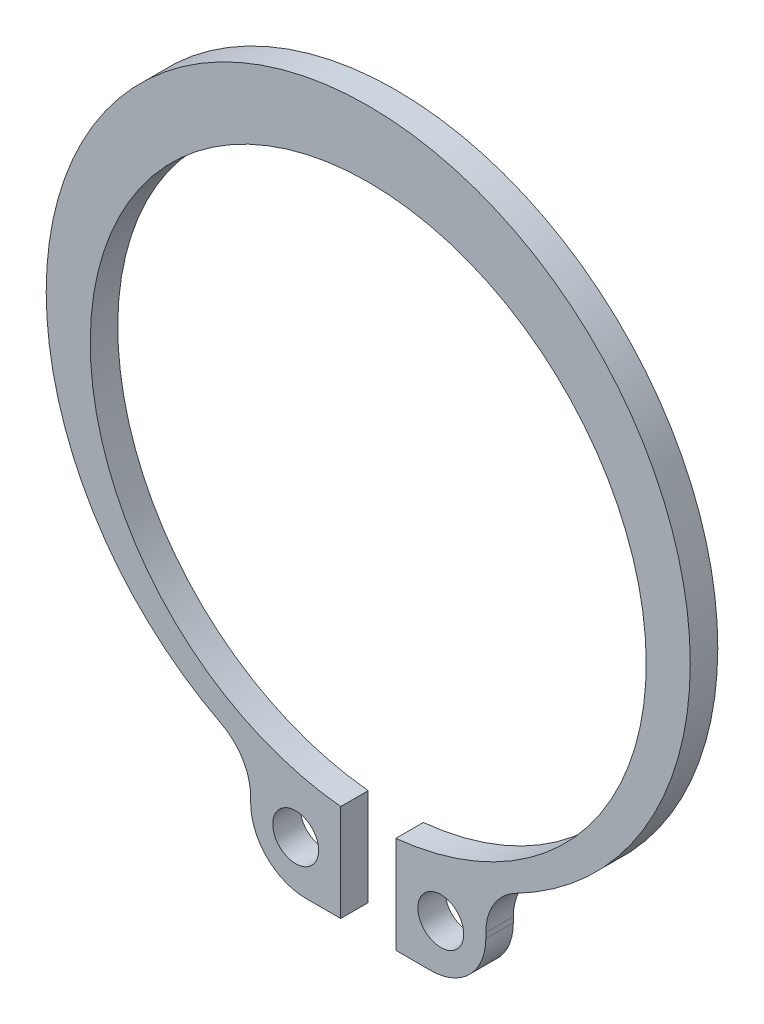
ISO-10303-21;
HEADER;
FILE_DESCRIPTION(('STEP AP214'),'2;1');
FILE_NAME('part.step','',(''),(''),'','','');
FILE_SCHEMA(('AUTOMOTIVE_DESIGN { 1 0 10303 214 1 1 1 1 }'));
ENDSEC;
DATA;
#1=APPLICATION_CONTEXT('core data for automotive mechanical design processes');
#2=APPLICATION_PROTOCOL_DEFINITION('international standard','automotive_design',2000,#1);
#3=PRODUCT_CONTEXT('',#1,'mechanical');
#4=PRODUCT('Part','Part','',(#3));
#5=PRODUCT_RELATED_PRODUCT_CATEGORY('part','',(#4));
#6=PRODUCT_DEFINITION_FORMATION('','',#4);
#7=PRODUCT_DEFINITION_CONTEXT('part definition',#1,'design');
#8=PRODUCT_DEFINITION('design','',#6,#7);
#9=PRODUCT_DEFINITION_SHAPE('','',#8);
#10=(LENGTH_UNIT() NAMED_UNIT(*) SI_UNIT(.MILLI.,.METRE.));
#11=(NAMED_UNIT(*) PLANE_ANGLE_UNIT() SI_UNIT($,.RADIAN.));
#12=(NAMED_UNIT(*) SI_UNIT($,.STERADIAN.) SOLID_ANGLE_UNIT());
#13=UNCERTAINTY_MEASURE_WITH_UNIT(LENGTH_MEASURE(1.E-05),#10,'distance_accuracy_value','');
#14=(GEOMETRIC_REPRESENTATION_CONTEXT(3) GLOBAL_UNCERTAINTY_ASSIGNED_CONTEXT((#13)) GLOBAL_UNIT_ASSIGNED_CONTEXT((#10,
#11,#12)) REPRESENTATION_CONTEXT('',''));
#15=CARTESIAN_POINT('',(0.,0.,0.));
#16=DIRECTION('',(0.,0.,1.));
#17=DIRECTION('',(1.,0.,0.));
#18=AXIS2_PLACEMENT_3D('',#15,#16,#17);
#19=CARTESIAN_POINT('',(-9.40667556246859,-17.0706583040255,1.5));
#20=DIRECTION('',(0.,0.,-1.));
#21=DIRECTION('',(-1.,0.,0.));
#22=AXIS2_PLACEMENT_3D('',#19,#20,#21);
#23=CYLINDRICAL_SURFACE('',#22,3.);
#24=CARTESIAN_POINT('',(-9.40667556246859,-17.0706583040255,0.));
#25=DIRECTION('',(0.,0.,1.));
#26=DIRECTION('',(1.,0.,0.));
#27=AXIS2_PLACEMENT_3D('',#24,#25,#26);
#28=CIRCLE('',#27,3.);
#29=CARTESIAN_POINT('',(-6.40667556246859,-17.0706583040255,0.));
#30=VERTEX_POINT('',#29);
#31=CARTESIAN_POINT('',(-8.03343825407902,-14.4034089165765,0.));
#32=VERTEX_POINT('',#31);
#33=EDGE_CURVE('E126',#30,#32,#28,.T.);
#34=ORIENTED_EDGE('',*,*,#33,.F.);
#35=DIRECTION('',(0.,0.,-1.));
#36=VECTOR('',#35,1.);
#37=CARTESIAN_POINT('',(-6.40667556246859,-17.0706583040255,1.5));
#38=LINE('',#37,#36);
#39=CARTESIAN_POINT('',(-6.40667556246859,-17.0706583040255,1.5));
#40=VERTEX_POINT('',#39);
#41=EDGE_CURVE('E31',#40,#30,#38,.T.);
#42=ORIENTED_EDGE('',*,*,#41,.F.);
#43=CARTESIAN_POINT('',(-9.40667556246859,-17.0706583040255,1.5));
#44=DIRECTION('',(0.,0.,1.));
#45=DIRECTION('',(1.,0.,0.));
#46=AXIS2_PLACEMENT_3D('',#43,#44,#45);
#47=CIRCLE('',#46,3.);
#48=CARTESIAN_POINT('',(-8.03343825407902,-14.4034089165765,1.5));
#49=VERTEX_POINT('',#48);
#50=EDGE_CURVE('E156',#40,#49,#47,.T.);
#51=ORIENTED_EDGE('',*,*,#50,.T.);
#52=DIRECTION('',(0.,0.,-1.));
#53=VECTOR('',#52,1.);
#54=CARTESIAN_POINT('',(-8.03343825407902,-14.4034089165765,1.5));
#55=LINE('',#54,#53);
#56=EDGE_CURVE('E11',#49,#32,#55,.T.);
#57=ORIENTED_EDGE('',*,*,#56,.T.);
#58=EDGE_LOOP('',(#34,#42,#51,#57));
#59=FACE_BOUND('',#58,.T.);
#60=ADVANCED_FACE('F17',(#59),#23,.F.);
#61=CARTESIAN_POINT('',(0.,1.2,1.5));
#62=DIRECTION('',(0.,0.,-1.));
#63=DIRECTION('',(-1.,0.,0.));
#64=AXIS2_PLACEMENT_3D('',#61,#62,#63);
#65=CYLINDRICAL_SURFACE('',#64,17.55);
#66=CARTESIAN_POINT('',(0.,1.2,0.));
#67=DIRECTION('',(0.,0.,1.));
#68=DIRECTION('',(1.,0.,0.));
#69=AXIS2_PLACEMENT_3D('',#66,#67,#68);
#70=CIRCLE('',#69,17.55);
#71=CARTESIAN_POINT('',(8.033438254079,-14.4034089165765,0.));
#72=VERTEX_POINT('',#71);
#73=EDGE_CURVE('E108',#72,#32,#70,.T.);
#74=ORIENTED_EDGE('',*,*,#73,.T.);
#75=ORIENTED_EDGE('',*,*,#56,.F.);
#76=CARTESIAN_POINT('',(0.,1.2,1.5));
#77=DIRECTION('',(0.,0.,1.));
#78=DIRECTION('',(1.,0.,0.));
#79=AXIS2_PLACEMENT_3D('',#76,#77,#78);
#80=CIRCLE('',#79,17.55);
#81=CARTESIAN_POINT('',(8.033438254079,-14.4034089165765,1.5));
#82=VERTEX_POINT('',#81);
#83=EDGE_CURVE('E111',#82,#49,#80,.T.);
#84=ORIENTED_EDGE('',*,*,#83,.F.);
#85=DIRECTION('',(0.,0.,-1.));
#86=VECTOR('',#85,1.);
#87=CARTESIAN_POINT('',(8.033438254079,-14.4034089165765,1.5));
#88=LINE('',#87,#86);
#89=EDGE_CURVE('E20',#82,#72,#88,.T.);
#90=ORIENTED_EDGE('',*,*,#89,.T.);
#91=EDGE_LOOP('',(#74,#75,#84,#90));
#92=FACE_BOUND('',#91,.T.);
#93=ADVANCED_FACE('F106',(#92),#65,.T.);
#94=CARTESIAN_POINT('',(9.40667556246858,-17.0706583040255,1.5));
#95=DIRECTION('',(0.,0.,-1.));
#96=DIRECTION('',(-1.,0.,0.));
#97=AXIS2_PLACEMENT_3D('',#94,#95,#96);
#98=CYLINDRICAL_SURFACE('',#97,3.);
#99=CARTESIAN_POINT('',(9.40667556246858,-17.0706583040255,0.));
#100=DIRECTION('',(0.,0.,1.));
#101=DIRECTION('',(1.,0.,0.));
#102=AXIS2_PLACEMENT_3D('',#99,#100,#101);
#103=CIRCLE('',#102,3.);
#104=CARTESIAN_POINT('',(6.40667556246858,-17.0706583040255,0.));
#105=VERTEX_POINT('',#104);
#106=EDGE_CURVE('E117',#72,#105,#103,.T.);
#107=ORIENTED_EDGE('',*,*,#106,.F.);
#108=ORIENTED_EDGE('',*,*,#89,.F.);
#109=CARTESIAN_POINT('',(9.40667556246858,-17.0706583040255,1.5));
#110=DIRECTION('',(0.,0.,1.));
#111=DIRECTION('',(1.,0.,0.));
#112=AXIS2_PLACEMENT_3D('',#109,#110,#111);
#113=CIRCLE('',#112,3.);
#114=CARTESIAN_POINT('',(6.40667556246858,-17.0706583040255,1.5));
#115=VERTEX_POINT('',#114);
#116=EDGE_CURVE('E159',#82,#115,#113,.T.);
#117=ORIENTED_EDGE('',*,*,#116,.T.);
#118=DIRECTION('',(0.,0.,-1.));
#119=VECTOR('',#118,1.);
#120=CARTESIAN_POINT('',(6.40667556246858,-17.0706583040255,1.5));
#121=LINE('',#120,#119);
#122=EDGE_CURVE('E115',#115,#105,#121,.T.);
#123=ORIENTED_EDGE('',*,*,#122,.T.);
#124=EDGE_LOOP('',(#107,#108,#117,#123));
#125=FACE_BOUND('',#124,.T.);
#126=ADVANCED_FACE('F118',(#125),#98,.F.);
#127=CARTESIAN_POINT('',(6.40667556246858,-17.36,1.5));
#128=DIRECTION('',(-1.,0.,0.));
#129=DIRECTION('',(0.,-1.,0.));
#130=AXIS2_PLACEMENT_3D('',#127,#128,#129);
#131=PLANE('',#130);
#132=DIRECTION('',(0.,1.,0.));
#133=VECTOR('',#132,1.);
#134=CARTESIAN_POINT('',(6.40667556246858,-17.36,0.));
#135=LINE('',#134,#133);
#136=CARTESIAN_POINT('',(6.40667556246858,-17.36,0.));
#137=VERTEX_POINT('',#136);
#138=EDGE_CURVE('E122',#137,#105,#135,.T.);
#139=ORIENTED_EDGE('',*,*,#138,.T.);
#140=ORIENTED_EDGE('',*,*,#122,.F.);
#141=DIRECTION('',(0.,1.,0.));
#142=VECTOR('',#141,1.);
#143=CARTESIAN_POINT('',(6.40667556246858,-17.36,1.5));
#144=LINE('',#143,#142);
#145=CARTESIAN_POINT('',(6.40667556246858,-17.36,1.5));
#146=VERTEX_POINT('',#145);
#147=EDGE_CURVE('E161',#146,#115,#144,.T.);
#148=ORIENTED_EDGE('',*,*,#147,.F.);
#149=DIRECTION('',(0.,0.,-1.));
#150=VECTOR('',#149,1.);
#151=CARTESIAN_POINT('',(6.40667556246858,-17.36,1.5));
#152=LINE('',#151,#150);
#153=EDGE_CURVE('E203',#146,#137,#152,.T.);
#154=ORIENTED_EDGE('',*,*,#153,.T.);
#155=EDGE_LOOP('',(#139,#140,#148,#154));
#156=FACE_BOUND('',#155,.T.);
#157=ADVANCED_FACE('F207',(#156),#131,.F.);
#158=CARTESIAN_POINT('',(3.40667556246858,-17.36,1.5));
#159=DIRECTION('',(0.,0.,-1.));
#160=DIRECTION('',(-1.,0.,0.));
#161=AXIS2_PLACEMENT_3D('',#158,#159,#160);
#162=CYLINDRICAL_SURFACE('',#161,3.);
#163=CARTESIAN_POINT('',(3.40667556246858,-17.36,0.));
#164=DIRECTION('',(0.,0.,1.));
#165=DIRECTION('',(1.,0.,0.));
#166=AXIS2_PLACEMENT_3D('',#163,#164,#165);
#167=CIRCLE('',#166,3.);
#168=CARTESIAN_POINT('',(3.40667556246858,-20.36,0.));
#169=VERTEX_POINT('',#168);
#170=EDGE_CURVE('E134',#169,#137,#167,.T.);
#171=ORIENTED_EDGE('',*,*,#170,.T.);
#172=ORIENTED_EDGE('',*,*,#153,.F.);
#173=CARTESIAN_POINT('',(3.40667556246858,-17.36,1.5));
#174=DIRECTION('',(0.,0.,1.));
#175=DIRECTION('',(1.,0.,0.));
#176=AXIS2_PLACEMENT_3D('',#173,#174,#175);
#177=CIRCLE('',#176,3.);
#178=CARTESIAN_POINT('',(3.40667556246858,-20.36,1.5));
#179=VERTEX_POINT('',#178);
#180=EDGE_CURVE('E164',#179,#146,#177,.T.);
#181=ORIENTED_EDGE('',*,*,#180,.F.);
#182=DIRECTION('',(0.,0.,-1.));
#183=VECTOR('',#182,1.);
#184=CARTESIAN_POINT('',(3.40667556246858,-20.36,1.5));
#185=LINE('',#184,#183);
#186=EDGE_CURVE('E201',#179,#169,#185,.T.);
#187=ORIENTED_EDGE('',*,*,#186,.T.);
#188=EDGE_LOOP('',(#171,#172,#181,#187));
#189=FACE_BOUND('',#188,.T.);
#190=ADVANCED_FACE('F211',(#189),#162,.T.);
#191=CARTESIAN_POINT('',(1.5,-20.36,1.5));
#192=DIRECTION('',(0.,1.,0.));
#193=DIRECTION('',(0.,0.,1.));
#194=AXIS2_PLACEMENT_3D('',#191,#192,#193);
#195=PLANE('',#194);
#196=DIRECTION('',(1.,0.,0.));
#197=VECTOR('',#196,1.);
#198=CARTESIAN_POINT('',(1.5,-20.36,0.));
#199=LINE('',#198,#197);
#200=CARTESIAN_POINT('',(1.5,-20.36,0.));
#201=VERTEX_POINT('',#200);
#202=EDGE_CURVE('E137',#201,#169,#199,.T.);
#203=ORIENTED_EDGE('',*,*,#202,.T.);
#204=ORIENTED_EDGE('',*,*,#186,.F.);
#205=DIRECTION('',(1.,0.,0.));
#206=VECTOR('',#205,1.);
#207=CARTESIAN_POINT('',(1.5,-20.36,1.5));
#208=LINE('',#207,#206);
#209=CARTESIAN_POINT('',(1.5,-20.36,1.5));
#210=VERTEX_POINT('',#209);
#211=EDGE_CURVE('E167',#210,#179,#208,.T.);
#212=ORIENTED_EDGE('',*,*,#211,.F.);
#213=DIRECTION('',(0.,0.,-1.));
#214=VECTOR('',#213,1.);
#215=CARTESIAN_POINT('',(1.5,-20.36,1.5));
#216=LINE('',#215,#214);
#217=EDGE_CURVE('E199',#210,#201,#216,.T.);
#218=ORIENTED_EDGE('',*,*,#217,.T.);
#219=EDGE_LOOP('',(#203,#204,#212,#218));
#220=FACE_BOUND('',#219,.T.);
#221=ADVANCED_FACE('F215',(#220),#195,.F.);
#222=CARTESIAN_POINT('',(1.5,-20.36,1.5));
#223=DIRECTION('',(-1.,0.,0.));
#224=DIRECTION('',(0.,-1.,0.));
#225=AXIS2_PLACEMENT_3D('',#222,#223,#224);
#226=PLANE('',#225);
#227=DIRECTION('',(0.,1.,0.));
#228=VECTOR('',#227,1.);
#229=CARTESIAN_POINT('',(1.5,-20.36,0.));
#230=LINE('',#229,#228);
#231=CARTESIAN_POINT('',(1.5,-15.0755596911027,0.));
#232=VERTEX_POINT('',#231);
#233=EDGE_CURVE('E140',#201,#232,#230,.T.);
#234=ORIENTED_EDGE('',*,*,#233,.F.);
#235=ORIENTED_EDGE('',*,*,#217,.F.);
#236=DIRECTION('',(0.,1.,0.));
#237=VECTOR('',#236,1.);
#238=CARTESIAN_POINT('',(1.5,-20.36,1.5));
#239=LINE('',#238,#237);
#240=CARTESIAN_POINT('',(1.5,-15.0755596911027,1.5));
#241=VERTEX_POINT('',#240);
#242=EDGE_CURVE('E170',#210,#241,#239,.T.);
#243=ORIENTED_EDGE('',*,*,#242,.T.);
#244=DIRECTION('',(0.,0.,-1.));
#245=VECTOR('',#244,1.);
#246=CARTESIAN_POINT('',(1.5,-15.0755596911027,1.5));
#247=LINE('',#246,#245);
#248=EDGE_CURVE('E197',#241,#232,#247,.T.);
#249=ORIENTED_EDGE('',*,*,#248,.T.);
#250=EDGE_LOOP('',(#234,#235,#243,#249));
#251=FACE_BOUND('',#250,.T.);
#252=ADVANCED_FACE('F219',(#251),#226,.T.);
#253=CARTESIAN_POINT('',(0.,0.,1.5));
#254=DIRECTION('',(0.,0.,-1.));
#255=DIRECTION('',(-1.,0.,0.));
#256=AXIS2_PLACEMENT_3D('',#253,#254,#255);
#257=CYLINDRICAL_SURFACE('',#256,15.15);
#258=CARTESIAN_POINT('',(0.,0.,0.));
#259=DIRECTION('',(0.,0.,1.));
#260=DIRECTION('',(1.,0.,0.));
#261=AXIS2_PLACEMENT_3D('',#258,#259,#260);
#262=CIRCLE('',#261,15.15);
#263=CARTESIAN_POINT('',(-1.5,-15.0755596911027,0.));
#264=VERTEX_POINT('',#263);
#265=EDGE_CURVE('E143',#232,#264,#262,.T.);
#266=ORIENTED_EDGE('',*,*,#265,.F.);
#267=ORIENTED_EDGE('',*,*,#248,.F.);
#268=CARTESIAN_POINT('',(0.,0.,1.5));
#269=DIRECTION('',(0.,0.,1.));
#270=DIRECTION('',(1.,0.,0.));
#271=AXIS2_PLACEMENT_3D('',#268,#269,#270);
#272=CIRCLE('',#271,15.15);
#273=CARTESIAN_POINT('',(-1.5,-15.0755596911027,1.5));
#274=VERTEX_POINT('',#273);
#275=EDGE_CURVE('E173',#241,#274,#272,.T.);
#276=ORIENTED_EDGE('',*,*,#275,.T.);
#277=DIRECTION('',(0.,0.,-1.));
#278=VECTOR('',#277,1.);
#279=CARTESIAN_POINT('',(-1.5,-15.0755596911027,1.5));
#280=LINE('',#279,#278);
#281=EDGE_CURVE('E195',#274,#264,#280,.T.);
#282=ORIENTED_EDGE('',*,*,#281,.T.);
#283=EDGE_LOOP('',(#266,#267,#276,#282));
#284=FACE_BOUND('',#283,.T.);
#285=ADVANCED_FACE('F223',(#284),#257,.F.);
#286=CARTESIAN_POINT('',(-1.5,-20.36,1.5));
#287=DIRECTION('',(-1.,0.,0.));
#288=DIRECTION('',(0.,-1.,0.));
#289=AXIS2_PLACEMENT_3D('',#286,#287,#288);
#290=PLANE('',#289);
#291=DIRECTION('',(0.,1.,0.));
#292=VECTOR('',#291,1.);
#293=CARTESIAN_POINT('',(-1.5,-20.36,0.));
#294=LINE('',#293,#292);
#295=CARTESIAN_POINT('',(-1.5,-20.36,0.));
#296=VERTEX_POINT('',#295);
#297=EDGE_CURVE('E146',#296,#264,#294,.T.);
#298=ORIENTED_EDGE('',*,*,#297,.T.);
#299=ORIENTED_EDGE('',*,*,#281,.F.);
#300=DIRECTION('',(0.,1.,0.));
#301=VECTOR('',#300,1.);
#302=CARTESIAN_POINT('',(-1.5,-20.36,1.5));
#303=LINE('',#302,#301);
#304=CARTESIAN_POINT('',(-1.5,-20.36,1.5));
#305=VERTEX_POINT('',#304);
#306=EDGE_CURVE('E176',#305,#274,#303,.T.);
#307=ORIENTED_EDGE('',*,*,#306,.F.);
#308=DIRECTION('',(0.,0.,-1.));
#309=VECTOR('',#308,1.);
#310=CARTESIAN_POINT('',(-1.5,-20.36,1.5));
#311=LINE('',#310,#309);
#312=EDGE_CURVE('E193',#305,#296,#311,.T.);
#313=ORIENTED_EDGE('',*,*,#312,.T.);
#314=EDGE_LOOP('',(#298,#299,#307,#313));
#315=FACE_BOUND('',#314,.T.);
#316=ADVANCED_FACE('F228',(#315),#290,.F.);
#317=CARTESIAN_POINT('',(-3.40667556246859,-20.36,1.5));
#318=DIRECTION('',(0.,1.,0.));
#319=DIRECTION('',(0.,0.,1.));
#320=AXIS2_PLACEMENT_3D('',#317,#318,#319);
#321=PLANE('',#320);
#322=DIRECTION('',(1.,0.,0.));
#323=VECTOR('',#322,1.);
#324=CARTESIAN_POINT('',(-3.40667556246859,-20.36,0.));
#325=LINE('',#324,#323);
#326=CARTESIAN_POINT('',(-3.40667556246859,-20.36,0.));
#327=VERTEX_POINT('',#326);
#328=EDGE_CURVE('E149',#327,#296,#325,.T.);
#329=ORIENTED_EDGE('',*,*,#328,.T.);
#330=ORIENTED_EDGE('',*,*,#312,.F.);
#331=DIRECTION('',(1.,0.,0.));
#332=VECTOR('',#331,1.);
#333=CARTESIAN_POINT('',(-3.40667556246859,-20.36,1.5));
#334=LINE('',#333,#332);
#335=CARTESIAN_POINT('',(-3.40667556246859,-20.36,1.5));
#336=VERTEX_POINT('',#335);
#337=EDGE_CURVE('E179',#336,#305,#334,.T.);
#338=ORIENTED_EDGE('',*,*,#337,.F.);
#339=DIRECTION('',(0.,0.,-1.));
#340=VECTOR('',#339,1.);
#341=CARTESIAN_POINT('',(-3.40667556246859,-20.36,1.5));
#342=LINE('',#341,#340);
#343=EDGE_CURVE('E191',#336,#327,#342,.T.);
#344=ORIENTED_EDGE('',*,*,#343,.T.);
#345=EDGE_LOOP('',(#329,#330,#338,#344));
#346=FACE_BOUND('',#345,.T.);
#347=ADVANCED_FACE('F232',(#346),#321,.F.);
#348=CARTESIAN_POINT('',(-3.40667556246858,-17.36,1.5));
#349=DIRECTION('',(0.,0.,-1.));
#350=DIRECTION('',(-1.,0.,0.));
#351=AXIS2_PLACEMENT_3D('',#348,#349,#350);
#352=CYLINDRICAL_SURFACE('',#351,3.);
#353=CARTESIAN_POINT('',(-3.40667556246858,-17.36,0.));
#354=DIRECTION('',(0.,0.,1.));
#355=DIRECTION('',(1.,0.,0.));
#356=AXIS2_PLACEMENT_3D('',#353,#354,#355);
#357=CIRCLE('',#356,3.);
#358=CARTESIAN_POINT('',(-6.40667556246859,-17.36,0.));
#359=VERTEX_POINT('',#358);
#360=EDGE_CURVE('E152',#359,#327,#357,.T.);
#361=ORIENTED_EDGE('',*,*,#360,.T.);
#362=ORIENTED_EDGE('',*,*,#343,.F.);
#363=CARTESIAN_POINT('',(-3.40667556246858,-17.36,1.5));
#364=DIRECTION('',(0.,0.,1.));
#365=DIRECTION('',(1.,0.,0.));
#366=AXIS2_PLACEMENT_3D('',#363,#364,#365);
#367=CIRCLE('',#366,3.);
#368=CARTESIAN_POINT('',(-6.40667556246859,-17.36,1.5));
#369=VERTEX_POINT('',#368);
#370=EDGE_CURVE('E182',#369,#336,#367,.T.);
#371=ORIENTED_EDGE('',*,*,#370,.F.);
#372=DIRECTION('',(0.,0.,-1.));
#373=VECTOR('',#372,1.);
#374=CARTESIAN_POINT('',(-6.40667556246859,-17.36,1.5));
#375=LINE('',#374,#373);
#376=EDGE_CURVE('E38',#369,#359,#375,.T.);
#377=ORIENTED_EDGE('',*,*,#376,.T.);
#378=EDGE_LOOP('',(#361,#362,#371,#377));
#379=FACE_BOUND('',#378,.T.);
#380=ADVANCED_FACE('F234',(#379),#352,.T.);
#381=CARTESIAN_POINT('',(-6.40667556246859,-17.0706583040255,1.5));
#382=DIRECTION('',(1.,0.,0.));
#383=DIRECTION('',(0.,0.,-1.));
#384=AXIS2_PLACEMENT_3D('',#381,#382,#383);
#385=PLANE('',#384);
#386=DIRECTION('',(0.,-1.,0.));
#387=VECTOR('',#386,1.);
#388=CARTESIAN_POINT('',(-6.40667556246859,-17.0706583040255,0.));
#389=LINE('',#388,#387);
#390=EDGE_CURVE('E155',#30,#359,#389,.T.);
#391=ORIENTED_EDGE('',*,*,#390,.T.);
#392=ORIENTED_EDGE('',*,*,#376,.F.);
#393=DIRECTION('',(0.,-1.,0.));
#394=VECTOR('',#393,1.);
#395=CARTESIAN_POINT('',(-6.40667556246859,-17.0706583040255,1.5));
#396=LINE('',#395,#394);
#397=EDGE_CURVE('E185',#40,#369,#396,.T.);
#398=ORIENTED_EDGE('',*,*,#397,.F.);
#399=ORIENTED_EDGE('',*,*,#41,.T.);
#400=EDGE_LOOP('',(#391,#392,#398,#399));
#401=FACE_BOUND('',#400,.T.);
#402=ADVANCED_FACE('F238',(#401),#385,.F.);
#403=CARTESIAN_POINT('',(-9.40667556246859,-17.0706583040255,1.5));
#404=DIRECTION('',(0.,0.,1.));
#405=DIRECTION('',(1.,0.,0.));
#406=AXIS2_PLACEMENT_3D('',#403,#404,#405);
#407=PLANE('',#406);
#408=CARTESIAN_POINT('',(-3.95333778123429,-17.75,1.5));
#409=DIRECTION('',(0.,0.,-1.));
#410=DIRECTION('',(0.,1.,0.));
#411=AXIS2_PLACEMENT_3D('',#408,#409,#410);
#412=CIRCLE('',#411,1.25);
#413=CARTESIAN_POINT('',(-3.95333778123429,-16.5,1.5));
#414=VERTEX_POINT('',#413);
#415=EDGE_CURVE('E333',#414,#414,#412,.T.);
#416=ORIENTED_EDGE('',*,*,#415,.T.);
#417=EDGE_LOOP('',(#416));
#418=FACE_BOUND('',#417,.T.);
#419=CARTESIAN_POINT('',(3.95333778123429,-17.75,1.5));
#420=DIRECTION('',(0.,0.,-1.));
#421=DIRECTION('',(0.,1.,0.));
#422=AXIS2_PLACEMENT_3D('',#419,#420,#421);
#423=CIRCLE('',#422,1.25);
#424=CARTESIAN_POINT('',(3.95333778123429,-16.5,1.5));
#425=VERTEX_POINT('',#424);
#426=EDGE_CURVE('E128',#425,#425,#423,.T.);
#427=ORIENTED_EDGE('',*,*,#426,.T.);
#428=EDGE_LOOP('',(#427));
#429=FACE_BOUND('',#428,.T.);
#430=ORIENTED_EDGE('',*,*,#50,.F.);
#431=ORIENTED_EDGE('',*,*,#397,.T.);
#432=ORIENTED_EDGE('',*,*,#370,.T.);
#433=ORIENTED_EDGE('',*,*,#337,.T.);
#434=ORIENTED_EDGE('',*,*,#306,.T.);
#435=ORIENTED_EDGE('',*,*,#275,.F.);
#436=ORIENTED_EDGE('',*,*,#242,.F.);
#437=ORIENTED_EDGE('',*,*,#211,.T.);
#438=ORIENTED_EDGE('',*,*,#180,.T.);
#439=ORIENTED_EDGE('',*,*,#147,.T.);
#440=ORIENTED_EDGE('',*,*,#116,.F.);
#441=ORIENTED_EDGE('',*,*,#83,.T.);
#442=EDGE_LOOP('',(#430,#431,#432,#433,#434,#435,#436,#437,#438,#439,#440,#441));
#443=FACE_BOUND('',#442,.T.);
#444=ADVANCED_FACE('F237',(#418,#429,#443),#407,.T.);
#445=CARTESIAN_POINT('',(-9.40667556246859,-17.0706583040255,0.));
#446=DIRECTION('',(0.,0.,1.));
#447=DIRECTION('',(1.,0.,0.));
#448=AXIS2_PLACEMENT_3D('',#445,#446,#447);
#449=PLANE('',#448);
#450=CARTESIAN_POINT('',(-3.95333778123429,-17.75,0.));
#451=DIRECTION('',(0.,0.,1.));
#452=DIRECTION('',(0.,1.,0.));
#453=AXIS2_PLACEMENT_3D('',#450,#451,#452);
#454=CIRCLE('',#453,1.25);
#455=CARTESIAN_POINT('',(-3.95333778123429,-16.5,0.));
#456=VERTEX_POINT('',#455);
#457=EDGE_CURVE('E336',#456,#456,#454,.T.);
#458=ORIENTED_EDGE('',*,*,#457,.T.);
#459=EDGE_LOOP('',(#458));
#460=FACE_BOUND('',#459,.T.);
#461=CARTESIAN_POINT('',(3.95333778123429,-17.75,0.));
#462=DIRECTION('',(0.,0.,1.));
#463=DIRECTION('',(0.,1.,0.));
#464=AXIS2_PLACEMENT_3D('',#461,#462,#463);
#465=CIRCLE('',#464,1.25);
#466=CARTESIAN_POINT('',(3.95333778123429,-16.5,0.));
#467=VERTEX_POINT('',#466);
#468=EDGE_CURVE('E338',#467,#467,#465,.T.);
#469=ORIENTED_EDGE('',*,*,#468,.T.);
#470=EDGE_LOOP('',(#469));
#471=FACE_BOUND('',#470,.T.);
#472=ORIENTED_EDGE('',*,*,#33,.T.);
#473=ORIENTED_EDGE('',*,*,#73,.F.);
#474=ORIENTED_EDGE('',*,*,#106,.T.);
#475=ORIENTED_EDGE('',*,*,#138,.F.);
#476=ORIENTED_EDGE('',*,*,#170,.F.);
#477=ORIENTED_EDGE('',*,*,#202,.F.);
#478=ORIENTED_EDGE('',*,*,#233,.T.);
#479=ORIENTED_EDGE('',*,*,#265,.T.);
#480=ORIENTED_EDGE('',*,*,#297,.F.);
#481=ORIENTED_EDGE('',*,*,#328,.F.);
#482=ORIENTED_EDGE('',*,*,#360,.F.);
#483=ORIENTED_EDGE('',*,*,#390,.F.);
#484=EDGE_LOOP('',(#472,#473,#474,#475,#476,#477,#478,#479,#480,#481,#482,#483));
#485=FACE_BOUND('',#484,.T.);
#486=ADVANCED_FACE('F124',(#460,#471,#485),#449,.F.);
#487=CARTESIAN_POINT('',(3.95333778123429,-17.75,0.));
#488=DIRECTION('',(0.,0.,1.));
#489=DIRECTION('',(0.,1.,0.));
#490=AXIS2_PLACEMENT_3D('',#487,#488,#489);
#491=CYLINDRICAL_SURFACE('',#490,1.25);
#492=ORIENTED_EDGE('',*,*,#426,.F.);
#493=EDGE_LOOP('',(#492));
#494=FACE_BOUND('',#493,.T.);
#495=ORIENTED_EDGE('',*,*,#468,.F.);
#496=EDGE_LOOP('',(#495));
#497=FACE_BOUND('',#496,.T.);
#498=ADVANCED_FACE('F304',(#494,#497),#491,.F.);
#499=CARTESIAN_POINT('',(-3.95333778123429,-17.75,0.));
#500=DIRECTION('',(0.,0.,1.));
#501=DIRECTION('',(0.,1.,0.));
#502=AXIS2_PLACEMENT_3D('',#499,#500,#501);
#503=CYLINDRICAL_SURFACE('',#502,1.25);
#504=ORIENTED_EDGE('',*,*,#415,.F.);
#505=EDGE_LOOP('',(#504));
#506=FACE_BOUND('',#505,.T.);
#507=ORIENTED_EDGE('',*,*,#457,.F.);
#508=EDGE_LOOP('',(#507));
#509=FACE_BOUND('',#508,.T.);
#510=ADVANCED_FACE('F314',(#506,#509),#503,.F.);
#511=CLOSED_SHELL('',(#60,#93,#126,#157,#190,#221,#252,#285,#316,#347,#380,#402,#444,#486,#498,#510));
#512=MANIFOLD_SOLID_BREP('B1',#511);
#513=ADVANCED_BREP_SHAPE_REPRESENTATION('',(#18,#512),#14);
#514=SHAPE_DEFINITION_REPRESENTATION(#9,#513);
ENDSEC;
END-ISO-10303-21;
